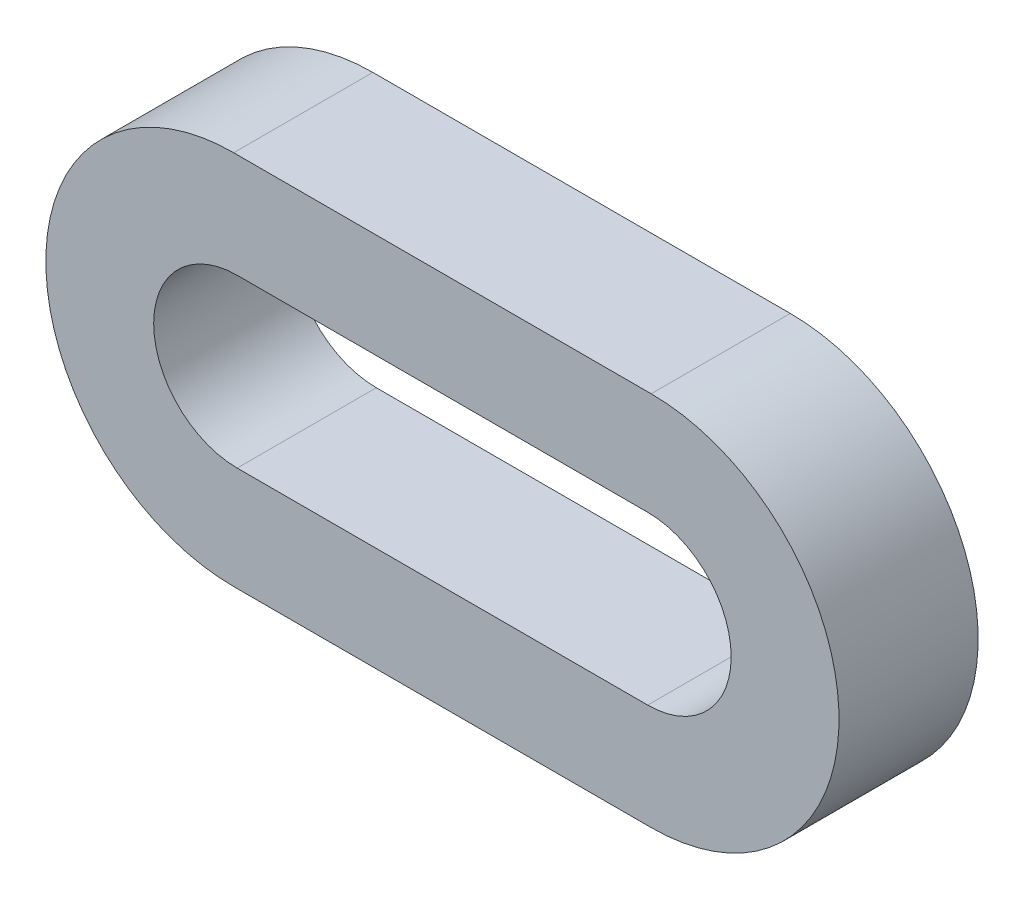
ISO-10303-21;
HEADER;
FILE_DESCRIPTION(('STEP AP214'),'2;1');
FILE_NAME('part.step','',(''),(''),'','','');
FILE_SCHEMA(('AUTOMOTIVE_DESIGN { 1 0 10303 214 1 1 1 1 }'));
ENDSEC;
DATA;
#1=APPLICATION_CONTEXT('core data for automotive mechanical design processes');
#2=APPLICATION_PROTOCOL_DEFINITION('international standard','automotive_design',2000,#1);
#3=PRODUCT_CONTEXT('',#1,'mechanical');
#4=PRODUCT('Part','Part','',(#3));
#5=PRODUCT_RELATED_PRODUCT_CATEGORY('part','',(#4));
#6=PRODUCT_DEFINITION_FORMATION('','',#4);
#7=PRODUCT_DEFINITION_CONTEXT('part definition',#1,'design');
#8=PRODUCT_DEFINITION('design','',#6,#7);
#9=PRODUCT_DEFINITION_SHAPE('','',#8);
#10=(LENGTH_UNIT() NAMED_UNIT(*) SI_UNIT(.MILLI.,.METRE.));
#11=(NAMED_UNIT(*) PLANE_ANGLE_UNIT() SI_UNIT($,.RADIAN.));
#12=(NAMED_UNIT(*) SI_UNIT($,.STERADIAN.) SOLID_ANGLE_UNIT());
#13=UNCERTAINTY_MEASURE_WITH_UNIT(LENGTH_MEASURE(1.E-05),#10,'distance_accuracy_value','');
#14=(GEOMETRIC_REPRESENTATION_CONTEXT(3) GLOBAL_UNCERTAINTY_ASSIGNED_CONTEXT((#13)) GLOBAL_UNIT_ASSIGNED_CONTEXT((#10,
#11,#12)) REPRESENTATION_CONTEXT('',''));
#15=CARTESIAN_POINT('',(0.,0.,0.));
#16=DIRECTION('',(0.,0.,1.));
#17=DIRECTION('',(1.,0.,0.));
#18=AXIS2_PLACEMENT_3D('',#15,#16,#17);
#19=CARTESIAN_POINT('',(-3.,0.,1.));
#20=DIRECTION('',(0.,0.,-1.));
#21=DIRECTION('',(-1.,0.,0.));
#22=AXIS2_PLACEMENT_3D('',#19,#20,#21);
#23=CYLINDRICAL_SURFACE('',#22,2.7);
#24=CARTESIAN_POINT('',(-3.,0.,-1.));
#25=DIRECTION('',(0.,0.,1.));
#26=DIRECTION('',(1.,0.,0.));
#27=AXIS2_PLACEMENT_3D('',#24,#25,#26);
#28=CIRCLE('',#27,2.7);
#29=CARTESIAN_POINT('',(-3.,2.7,-1.));
#30=VERTEX_POINT('',#29);
#31=CARTESIAN_POINT('',(-3.,-2.7,-1.));
#32=VERTEX_POINT('',#31);
#33=EDGE_CURVE('E130',#30,#32,#28,.T.);
#34=ORIENTED_EDGE('',*,*,#33,.T.);
#35=DIRECTION('',(0.,0.,-1.));
#36=VECTOR('',#35,1.);
#37=CARTESIAN_POINT('',(-3.,-2.7,1.));
#38=LINE('',#37,#36);
#39=CARTESIAN_POINT('',(-3.,-2.7,1.));
#40=VERTEX_POINT('',#39);
#41=EDGE_CURVE('E11',#40,#32,#38,.T.);
#42=ORIENTED_EDGE('',*,*,#41,.F.);
#43=CARTESIAN_POINT('',(-3.,0.,1.));
#44=DIRECTION('',(0.,0.,1.));
#45=DIRECTION('',(1.,0.,0.));
#46=AXIS2_PLACEMENT_3D('',#43,#44,#45);
#47=CIRCLE('',#46,2.7);
#48=CARTESIAN_POINT('',(-3.,2.7,1.));
#49=VERTEX_POINT('',#48);
#50=EDGE_CURVE('E133',#49,#40,#47,.T.);
#51=ORIENTED_EDGE('',*,*,#50,.F.);
#52=DIRECTION('',(0.,0.,-1.));
#53=VECTOR('',#52,1.);
#54=CARTESIAN_POINT('',(-3.,2.7,1.));
#55=LINE('',#54,#53);
#56=EDGE_CURVE('E143',#49,#30,#55,.T.);
#57=ORIENTED_EDGE('',*,*,#56,.T.);
#58=EDGE_LOOP('',(#34,#42,#51,#57));
#59=FACE_BOUND('',#58,.T.);
#60=ADVANCED_FACE('F32',(#59),#23,.T.);
#61=CARTESIAN_POINT('',(-3.,-2.7,1.));
#62=DIRECTION('',(0.,1.,0.));
#63=DIRECTION('',(-1.,0.,0.));
#64=AXIS2_PLACEMENT_3D('',#61,#62,#63);
#65=PLANE('',#64);
#66=DIRECTION('',(1.,0.,0.));
#67=VECTOR('',#66,1.);
#68=CARTESIAN_POINT('',(-3.,-2.7,-1.));
#69=LINE('',#68,#67);
#70=CARTESIAN_POINT('',(3.,-2.7,-1.));
#71=VERTEX_POINT('',#70);
#72=EDGE_CURVE('E146',#32,#71,#69,.T.);
#73=ORIENTED_EDGE('',*,*,#72,.T.);
#74=DIRECTION('',(0.,0.,-1.));
#75=VECTOR('',#74,1.);
#76=CARTESIAN_POINT('',(3.,-2.7,1.));
#77=LINE('',#76,#75);
#78=CARTESIAN_POINT('',(3.,-2.7,1.));
#79=VERTEX_POINT('',#78);
#80=EDGE_CURVE('E39',#79,#71,#77,.T.);
#81=ORIENTED_EDGE('',*,*,#80,.F.);
#82=DIRECTION('',(1.,0.,0.));
#83=VECTOR('',#82,1.);
#84=CARTESIAN_POINT('',(-3.,-2.7,1.));
#85=LINE('',#84,#83);
#86=EDGE_CURVE('E136',#40,#79,#85,.T.);
#87=ORIENTED_EDGE('',*,*,#86,.F.);
#88=ORIENTED_EDGE('',*,*,#41,.T.);
#89=EDGE_LOOP('',(#73,#81,#87,#88));
#90=FACE_BOUND('',#89,.T.);
#91=ADVANCED_FACE('F174',(#90),#65,.F.);
#92=CARTESIAN_POINT('',(3.,0.,1.));
#93=DIRECTION('',(0.,0.,-1.));
#94=DIRECTION('',(-1.,0.,0.));
#95=AXIS2_PLACEMENT_3D('',#92,#93,#94);
#96=CYLINDRICAL_SURFACE('',#95,2.7);
#97=CARTESIAN_POINT('',(3.,0.,-1.));
#98=DIRECTION('',(0.,0.,1.));
#99=DIRECTION('',(1.,0.,0.));
#100=AXIS2_PLACEMENT_3D('',#97,#98,#99);
#101=CIRCLE('',#100,2.7);
#102=CARTESIAN_POINT('',(3.,2.7,-1.));
#103=VERTEX_POINT('',#102);
#104=EDGE_CURVE('E148',#71,#103,#101,.T.);
#105=ORIENTED_EDGE('',*,*,#104,.T.);
#106=DIRECTION('',(0.,0.,-1.));
#107=VECTOR('',#106,1.);
#108=CARTESIAN_POINT('',(3.,2.7,1.));
#109=LINE('',#108,#107);
#110=CARTESIAN_POINT('',(3.,2.7,1.));
#111=VERTEX_POINT('',#110);
#112=EDGE_CURVE('E153',#111,#103,#109,.T.);
#113=ORIENTED_EDGE('',*,*,#112,.F.);
#114=CARTESIAN_POINT('',(3.,0.,1.));
#115=DIRECTION('',(0.,0.,1.));
#116=DIRECTION('',(1.,0.,0.));
#117=AXIS2_PLACEMENT_3D('',#114,#115,#116);
#118=CIRCLE('',#117,2.7);
#119=EDGE_CURVE('E139',#79,#111,#118,.T.);
#120=ORIENTED_EDGE('',*,*,#119,.F.);
#121=ORIENTED_EDGE('',*,*,#80,.T.);
#122=EDGE_LOOP('',(#105,#113,#120,#121));
#123=FACE_BOUND('',#122,.T.);
#124=ADVANCED_FACE('F160',(#123),#96,.T.);
#125=CARTESIAN_POINT('',(-3.,2.7,1.));
#126=DIRECTION('',(0.,-1.,0.));
#127=DIRECTION('',(0.,0.,-1.));
#128=AXIS2_PLACEMENT_3D('',#125,#126,#127);
#129=PLANE('',#128);
#130=DIRECTION('',(-1.,0.,0.));
#131=VECTOR('',#130,1.);
#132=CARTESIAN_POINT('',(-3.,2.7,-1.));
#133=LINE('',#132,#131);
#134=EDGE_CURVE('E137',#103,#30,#133,.T.);
#135=ORIENTED_EDGE('',*,*,#134,.T.);
#136=ORIENTED_EDGE('',*,*,#56,.F.);
#137=DIRECTION('',(-1.,0.,0.));
#138=VECTOR('',#137,1.);
#139=CARTESIAN_POINT('',(-3.,2.7,1.));
#140=LINE('',#139,#138);
#141=EDGE_CURVE('E141',#111,#49,#140,.T.);
#142=ORIENTED_EDGE('',*,*,#141,.F.);
#143=ORIENTED_EDGE('',*,*,#112,.T.);
#144=EDGE_LOOP('',(#135,#136,#142,#143));
#145=FACE_BOUND('',#144,.T.);
#146=ADVANCED_FACE('F169',(#145),#129,.F.);
#147=CARTESIAN_POINT('',(-3.,0.,1.));
#148=DIRECTION('',(0.,0.,1.));
#149=DIRECTION('',(1.,0.,0.));
#150=AXIS2_PLACEMENT_3D('',#147,#148,#149);
#151=PLANE('',#150);
#152=CARTESIAN_POINT('',(-2.95,0.,1.));
#153=DIRECTION('',(0.,0.,1.));
#154=DIRECTION('',(1.,0.,0.));
#155=AXIS2_PLACEMENT_3D('',#152,#153,#154);
#156=CIRCLE('',#155,1.2);
#157=CARTESIAN_POINT('',(-2.95,1.2,1.));
#158=VERTEX_POINT('',#157);
#159=CARTESIAN_POINT('',(-2.95,-1.2,1.));
#160=VERTEX_POINT('',#159);
#161=EDGE_CURVE('E46',#158,#160,#156,.T.);
#162=ORIENTED_EDGE('',*,*,#161,.F.);
#163=DIRECTION('',(-1.,0.,0.));
#164=VECTOR('',#163,1.);
#165=CARTESIAN_POINT('',(-2.95,1.2,1.));
#166=LINE('',#165,#164);
#167=CARTESIAN_POINT('',(2.95,1.2,1.));
#168=VERTEX_POINT('',#167);
#169=EDGE_CURVE('E114',#168,#158,#166,.T.);
#170=ORIENTED_EDGE('',*,*,#169,.F.);
#171=CARTESIAN_POINT('',(2.95,0.,1.));
#172=DIRECTION('',(0.,0.,1.));
#173=DIRECTION('',(1.,0.,0.));
#174=AXIS2_PLACEMENT_3D('',#171,#172,#173);
#175=CIRCLE('',#174,1.2);
#176=CARTESIAN_POINT('',(2.95,-1.2,1.));
#177=VERTEX_POINT('',#176);
#178=EDGE_CURVE('E98',#177,#168,#175,.T.);
#179=ORIENTED_EDGE('',*,*,#178,.F.);
#180=DIRECTION('',(1.,0.,0.));
#181=VECTOR('',#180,1.);
#182=CARTESIAN_POINT('',(-2.95,-1.2,1.));
#183=LINE('',#182,#181);
#184=EDGE_CURVE('E107',#160,#177,#183,.T.);
#185=ORIENTED_EDGE('',*,*,#184,.F.);
#186=EDGE_LOOP('',(#162,#170,#179,#185));
#187=FACE_BOUND('',#186,.T.);
#188=ORIENTED_EDGE('',*,*,#50,.T.);
#189=ORIENTED_EDGE('',*,*,#86,.T.);
#190=ORIENTED_EDGE('',*,*,#119,.T.);
#191=ORIENTED_EDGE('',*,*,#141,.T.);
#192=EDGE_LOOP('',(#188,#189,#190,#191));
#193=FACE_BOUND('',#192,.T.);
#194=ADVANCED_FACE('F111',(#187,#193),#151,.T.);
#195=CARTESIAN_POINT('',(-3.,0.,-1.));
#196=DIRECTION('',(0.,0.,1.));
#197=DIRECTION('',(1.,0.,0.));
#198=AXIS2_PLACEMENT_3D('',#195,#196,#197);
#199=PLANE('',#198);
#200=DIRECTION('',(-1.,0.,0.));
#201=VECTOR('',#200,1.);
#202=CARTESIAN_POINT('',(-2.95,1.2,-1.));
#203=LINE('',#202,#201);
#204=CARTESIAN_POINT('',(2.95,1.2,-1.));
#205=VERTEX_POINT('',#204);
#206=CARTESIAN_POINT('',(-2.95,1.2,-1.));
#207=VERTEX_POINT('',#206);
#208=EDGE_CURVE('E125',#205,#207,#203,.T.);
#209=ORIENTED_EDGE('',*,*,#208,.T.);
#210=CARTESIAN_POINT('',(-2.95,0.,-1.));
#211=DIRECTION('',(0.,0.,1.));
#212=DIRECTION('',(1.,0.,0.));
#213=AXIS2_PLACEMENT_3D('',#210,#211,#212);
#214=CIRCLE('',#213,1.2);
#215=CARTESIAN_POINT('',(-2.95,-1.2,-1.));
#216=VERTEX_POINT('',#215);
#217=EDGE_CURVE('E116',#207,#216,#214,.T.);
#218=ORIENTED_EDGE('',*,*,#217,.T.);
#219=DIRECTION('',(1.,0.,0.));
#220=VECTOR('',#219,1.);
#221=CARTESIAN_POINT('',(-2.95,-1.2,-1.));
#222=LINE('',#221,#220);
#223=CARTESIAN_POINT('',(2.95,-1.2,-1.));
#224=VERTEX_POINT('',#223);
#225=EDGE_CURVE('E122',#216,#224,#222,.T.);
#226=ORIENTED_EDGE('',*,*,#225,.T.);
#227=CARTESIAN_POINT('',(2.95,0.,-1.));
#228=DIRECTION('',(0.,0.,1.));
#229=DIRECTION('',(1.,0.,0.));
#230=AXIS2_PLACEMENT_3D('',#227,#228,#229);
#231=CIRCLE('',#230,1.2);
#232=EDGE_CURVE('E54',#224,#205,#231,.T.);
#233=ORIENTED_EDGE('',*,*,#232,.T.);
#234=EDGE_LOOP('',(#209,#218,#226,#233));
#235=FACE_BOUND('',#234,.T.);
#236=ORIENTED_EDGE('',*,*,#33,.F.);
#237=ORIENTED_EDGE('',*,*,#134,.F.);
#238=ORIENTED_EDGE('',*,*,#104,.F.);
#239=ORIENTED_EDGE('',*,*,#72,.F.);
#240=EDGE_LOOP('',(#236,#237,#238,#239));
#241=FACE_BOUND('',#240,.T.);
#242=ADVANCED_FACE('F166',(#235,#241),#199,.F.);
#243=CARTESIAN_POINT('',(-2.95,0.,-1.));
#244=DIRECTION('',(0.,0.,1.));
#245=DIRECTION('',(1.,0.,0.));
#246=AXIS2_PLACEMENT_3D('',#243,#244,#245);
#247=CYLINDRICAL_SURFACE('',#246,1.2);
#248=DIRECTION('',(0.,0.,1.));
#249=VECTOR('',#248,1.);
#250=CARTESIAN_POINT('',(-2.95,-1.2,-1.));
#251=LINE('',#250,#249);
#252=EDGE_CURVE('E104',#216,#160,#251,.T.);
#253=ORIENTED_EDGE('',*,*,#252,.F.);
#254=ORIENTED_EDGE('',*,*,#217,.F.);
#255=DIRECTION('',(0.,0.,1.));
#256=VECTOR('',#255,1.);
#257=CARTESIAN_POINT('',(-2.95,1.2,-1.));
#258=LINE('',#257,#256);
#259=EDGE_CURVE('E128',#207,#158,#258,.T.);
#260=ORIENTED_EDGE('',*,*,#259,.T.);
#261=ORIENTED_EDGE('',*,*,#161,.T.);
#262=EDGE_LOOP('',(#253,#254,#260,#261));
#263=FACE_BOUND('',#262,.T.);
#264=ADVANCED_FACE('F186',(#263),#247,.F.);
#265=CARTESIAN_POINT('',(-2.95,1.2,-1.));
#266=DIRECTION('',(0.,1.,0.));
#267=DIRECTION('',(0.,0.,1.));
#268=AXIS2_PLACEMENT_3D('',#265,#266,#267);
#269=PLANE('',#268);
#270=ORIENTED_EDGE('',*,*,#259,.F.);
#271=ORIENTED_EDGE('',*,*,#208,.F.);
#272=DIRECTION('',(0.,0.,1.));
#273=VECTOR('',#272,1.);
#274=CARTESIAN_POINT('',(2.95,1.2,-1.));
#275=LINE('',#274,#273);
#276=EDGE_CURVE('E103',#205,#168,#275,.T.);
#277=ORIENTED_EDGE('',*,*,#276,.T.);
#278=ORIENTED_EDGE('',*,*,#169,.T.);
#279=EDGE_LOOP('',(#270,#271,#277,#278));
#280=FACE_BOUND('',#279,.T.);
#281=ADVANCED_FACE('F192',(#280),#269,.F.);
#282=CARTESIAN_POINT('',(2.95,0.,-1.));
#283=DIRECTION('',(0.,0.,1.));
#284=DIRECTION('',(1.,0.,0.));
#285=AXIS2_PLACEMENT_3D('',#282,#283,#284);
#286=CYLINDRICAL_SURFACE('',#285,1.2);
#287=ORIENTED_EDGE('',*,*,#276,.F.);
#288=ORIENTED_EDGE('',*,*,#232,.F.);
#289=DIRECTION('',(0.,0.,1.));
#290=VECTOR('',#289,1.);
#291=CARTESIAN_POINT('',(2.95,-1.2,-1.));
#292=LINE('',#291,#290);
#293=EDGE_CURVE('E94',#224,#177,#292,.T.);
#294=ORIENTED_EDGE('',*,*,#293,.T.);
#295=ORIENTED_EDGE('',*,*,#178,.T.);
#296=EDGE_LOOP('',(#287,#288,#294,#295));
#297=FACE_BOUND('',#296,.T.);
#298=ADVANCED_FACE('F96',(#297),#286,.F.);
#299=CARTESIAN_POINT('',(-2.95,-1.2,-1.));
#300=DIRECTION('',(0.,-1.,0.));
#301=DIRECTION('',(0.,0.,-1.));
#302=AXIS2_PLACEMENT_3D('',#299,#300,#301);
#303=PLANE('',#302);
#304=ORIENTED_EDGE('',*,*,#293,.F.);
#305=ORIENTED_EDGE('',*,*,#225,.F.);
#306=ORIENTED_EDGE('',*,*,#252,.T.);
#307=ORIENTED_EDGE('',*,*,#184,.T.);
#308=EDGE_LOOP('',(#304,#305,#306,#307));
#309=FACE_BOUND('',#308,.T.);
#310=ADVANCED_FACE('F108',(#309),#303,.F.);
#311=CLOSED_SHELL('',(#60,#91,#124,#146,#194,#242,#264,#281,#298,#310));
#312=MANIFOLD_SOLID_BREP('B2',#311);
#313=ADVANCED_BREP_SHAPE_REPRESENTATION('',(#18,#312),#14);
#314=SHAPE_DEFINITION_REPRESENTATION(#9,#313);
ENDSEC;
END-ISO-10303-21;
